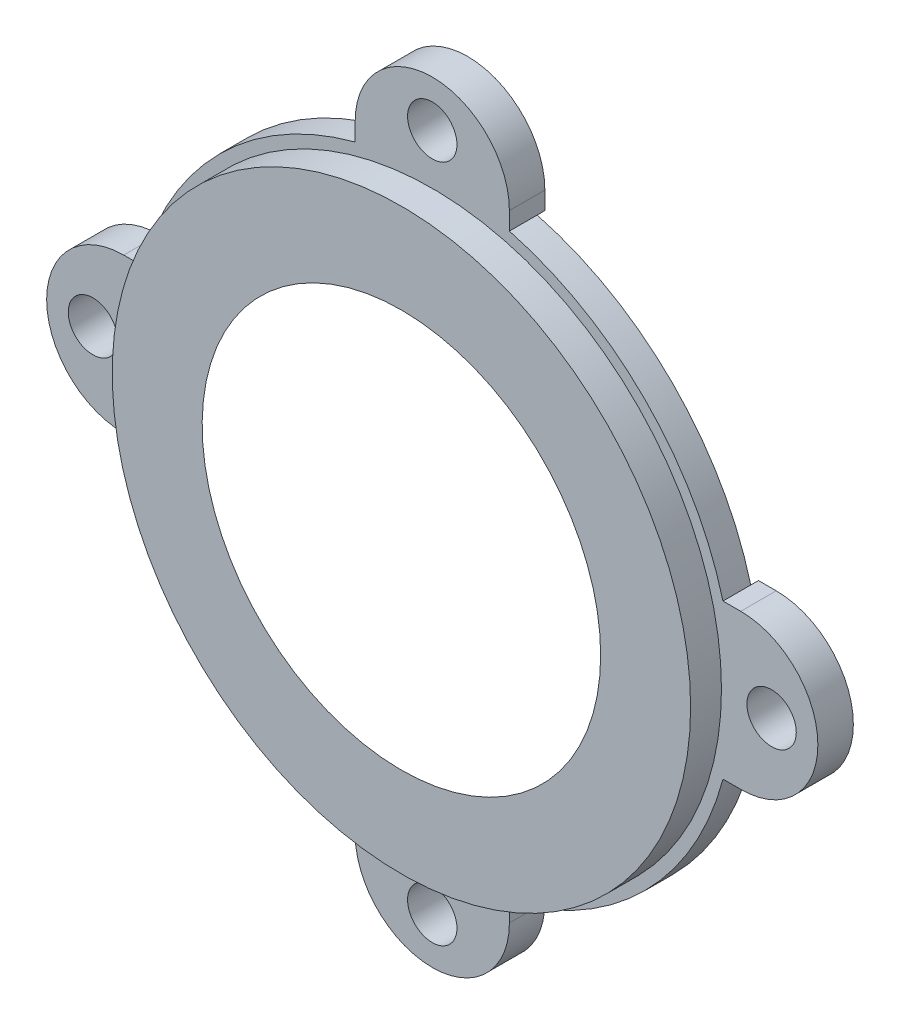
ISO-10303-21;
HEADER;
FILE_DESCRIPTION(('STEP AP214'),'2;1');
FILE_NAME('part.step','',(''),(''),'','','');
FILE_SCHEMA(('AUTOMOTIVE_DESIGN { 1 0 10303 214 1 1 1 1 }'));
ENDSEC;
DATA;
#1=APPLICATION_CONTEXT('core data for automotive mechanical design processes');
#2=APPLICATION_PROTOCOL_DEFINITION('international standard','automotive_design',2000,#1);
#3=PRODUCT_CONTEXT('',#1,'mechanical');
#4=PRODUCT('Part','Part','',(#3));
#5=PRODUCT_RELATED_PRODUCT_CATEGORY('part','',(#4));
#6=PRODUCT_DEFINITION_FORMATION('','',#4);
#7=PRODUCT_DEFINITION_CONTEXT('part definition',#1,'design');
#8=PRODUCT_DEFINITION('design','',#6,#7);
#9=PRODUCT_DEFINITION_SHAPE('','',#8);
#10=(LENGTH_UNIT() NAMED_UNIT(*) SI_UNIT(.MILLI.,.METRE.));
#11=(NAMED_UNIT(*) PLANE_ANGLE_UNIT() SI_UNIT($,.RADIAN.));
#12=(NAMED_UNIT(*) SI_UNIT($,.STERADIAN.) SOLID_ANGLE_UNIT());
#13=UNCERTAINTY_MEASURE_WITH_UNIT(LENGTH_MEASURE(1.E-05),#10,'distance_accuracy_value','');
#14=(GEOMETRIC_REPRESENTATION_CONTEXT(3) GLOBAL_UNCERTAINTY_ASSIGNED_CONTEXT((#13)) GLOBAL_UNIT_ASSIGNED_CONTEXT((#10,
#11,#12)) REPRESENTATION_CONTEXT('',''));
#15=CARTESIAN_POINT('',(0.,0.,0.));
#16=DIRECTION('',(0.,0.,1.));
#17=DIRECTION('',(1.,0.,0.));
#18=AXIS2_PLACEMENT_3D('',#15,#16,#17);
#19=CARTESIAN_POINT('',(0.,0.,1.8));
#20=DIRECTION('',(0.,0.,-1.));
#21=DIRECTION('',(-1.,0.,0.));
#22=AXIS2_PLACEMENT_3D('',#19,#20,#21);
#23=CYLINDRICAL_SURFACE('',#22,19.5);
#24=CARTESIAN_POINT('',(0.,0.,1.8));
#25=DIRECTION('',(0.,0.,1.));
#26=DIRECTION('',(1.,0.,0.));
#27=AXIS2_PLACEMENT_3D('',#24,#25,#26);
#28=CIRCLE('',#27,19.5);
#29=CARTESIAN_POINT('',(18.8480768249704,5.00000000000154,1.8));
#30=VERTEX_POINT('',#29);
#31=CARTESIAN_POINT('',(5.,18.8480768249708,1.8));
#32=VERTEX_POINT('',#31);
#33=EDGE_CURVE('E57',#30,#32,#28,.T.);
#34=ORIENTED_EDGE('',*,*,#33,.F.);
#35=DIRECTION('',(0.,0.,-1.));
#36=VECTOR('',#35,1.);
#37=CARTESIAN_POINT('',(18.8480768249704,5.00000000000154,13.5407903801862));
#38=LINE('',#37,#36);
#39=CARTESIAN_POINT('',(18.8480768249704,5.00000000000154,0.));
#40=VERTEX_POINT('',#39);
#41=EDGE_CURVE('E192',#30,#40,#38,.T.);
#42=ORIENTED_EDGE('',*,*,#41,.T.);
#43=CARTESIAN_POINT('',(0.,0.,0.));
#44=DIRECTION('',(0.,0.,1.));
#45=DIRECTION('',(1.,0.,0.));
#46=AXIS2_PLACEMENT_3D('',#43,#44,#45);
#47=CIRCLE('',#46,19.5);
#48=CARTESIAN_POINT('',(5.,18.8480768249708,0.));
#49=VERTEX_POINT('',#48);
#50=EDGE_CURVE('E311',#40,#49,#47,.T.);
#51=ORIENTED_EDGE('',*,*,#50,.T.);
#52=DIRECTION('',(0.,0.,-1.));
#53=VECTOR('',#52,1.);
#54=CARTESIAN_POINT('',(5.,18.8480768249708,1.8));
#55=LINE('',#54,#53);
#56=EDGE_CURVE('E353',#32,#49,#55,.T.);
#57=ORIENTED_EDGE('',*,*,#56,.F.);
#58=EDGE_LOOP('',(#34,#42,#51,#57));
#59=FACE_BOUND('',#58,.T.);
#60=ADVANCED_FACE('F41',(#59),#23,.T.);
#61=CARTESIAN_POINT('',(0.,0.,1.8));
#62=DIRECTION('',(0.,0.,1.));
#63=DIRECTION('',(1.,0.,0.));
#64=AXIS2_PLACEMENT_3D('',#61,#62,#63);
#65=PLANE('',#64);
#66=CARTESIAN_POINT('',(0.,0.,1.8));
#67=DIRECTION('',(0.,0.,1.));
#68=DIRECTION('',(1.,0.,0.));
#69=AXIS2_PLACEMENT_3D('',#66,#67,#68);
#70=CIRCLE('',#69,19.4999999999992);
#71=CARTESIAN_POINT('',(-18.8480768249704,-4.99999999999846,1.8));
#72=VERTEX_POINT('',#71);
#73=CARTESIAN_POINT('',(-5.,-18.8480768249699,1.8));
#74=VERTEX_POINT('',#73);
#75=EDGE_CURVE('E326',#72,#74,#70,.T.);
#76=ORIENTED_EDGE('',*,*,#75,.T.);
#77=DIRECTION('',(0.,-1.,0.));
#78=VECTOR('',#77,1.);
#79=CARTESIAN_POINT('',(-5.,-18.8480768249699,1.8));
#80=LINE('',#79,#78);
#81=CARTESIAN_POINT('',(-5.,-20.,1.8));
#82=VERTEX_POINT('',#81);
#83=EDGE_CURVE('E328',#74,#82,#80,.T.);
#84=ORIENTED_EDGE('',*,*,#83,.T.);
#85=CARTESIAN_POINT('',(0.,-20.,1.8));
#86=DIRECTION('',(0.,0.,1.));
#87=DIRECTION('',(1.,0.,0.));
#88=AXIS2_PLACEMENT_3D('',#85,#86,#87);
#89=CIRCLE('',#88,5.);
#90=CARTESIAN_POINT('',(5.,-20.,1.8));
#91=VERTEX_POINT('',#90);
#92=EDGE_CURVE('E362',#82,#91,#89,.T.);
#93=ORIENTED_EDGE('',*,*,#92,.T.);
#94=DIRECTION('',(0.,1.,0.));
#95=VECTOR('',#94,1.);
#96=CARTESIAN_POINT('',(5.,-25.,1.8));
#97=LINE('',#96,#95);
#98=CARTESIAN_POINT('',(5.,-18.8480768249708,1.8));
#99=VERTEX_POINT('',#98);
#100=EDGE_CURVE('E331',#91,#99,#97,.T.);
#101=ORIENTED_EDGE('',*,*,#100,.T.);
#102=CARTESIAN_POINT('',(18.8480768249711,-4.99999999999867,1.8));
#103=VERTEX_POINT('',#102);
#104=EDGE_CURVE('E312',#99,#103,#28,.T.);
#105=ORIENTED_EDGE('',*,*,#104,.T.);
#106=DIRECTION('',(-1.,-1.79206476713228E-13,0.));
#107=VECTOR('',#106,1.);
#108=CARTESIAN_POINT('',(18.8480768249711,-4.99999999999867,1.8));
#109=LINE('',#108,#107);
#110=CARTESIAN_POINT('',(20.,-4.99999999999846,1.8));
#111=VERTEX_POINT('',#110);
#112=EDGE_CURVE('E227',#111,#103,#109,.T.);
#113=ORIENTED_EDGE('',*,*,#112,.F.);
#114=CARTESIAN_POINT('',(20.,1.53783236145344E-12,1.8));
#115=DIRECTION('',(0.,0.,1.));
#116=DIRECTION('',(1.,0.,0.));
#117=AXIS2_PLACEMENT_3D('',#114,#115,#116);
#118=CIRCLE('',#117,5.);
#119=CARTESIAN_POINT('',(20.,5.00000000000154,1.8));
#120=VERTEX_POINT('',#119);
#121=EDGE_CURVE('E219',#120,#111,#118,.F.);
#122=ORIENTED_EDGE('',*,*,#121,.F.);
#123=DIRECTION('',(1.,0.,0.));
#124=VECTOR('',#123,1.);
#125=CARTESIAN_POINT('',(20.,5.00000000000154,1.8));
#126=LINE('',#125,#124);
#127=EDGE_CURVE('E189',#30,#120,#126,.T.);
#128=ORIENTED_EDGE('',*,*,#127,.F.);
#129=ORIENTED_EDGE('',*,*,#33,.T.);
#130=DIRECTION('',(0.,1.,0.));
#131=VECTOR('',#130,1.);
#132=CARTESIAN_POINT('',(5.,18.8480768249708,1.8));
#133=LINE('',#132,#131);
#134=CARTESIAN_POINT('',(5.,20.,1.8));
#135=VERTEX_POINT('',#134);
#136=EDGE_CURVE('E314',#32,#135,#133,.T.);
#137=ORIENTED_EDGE('',*,*,#136,.T.);
#138=CARTESIAN_POINT('',(0.,20.,1.8));
#139=DIRECTION('',(0.,0.,1.));
#140=DIRECTION('',(1.,0.,0.));
#141=AXIS2_PLACEMENT_3D('',#138,#139,#140);
#142=CIRCLE('',#141,5.);
#143=CARTESIAN_POINT('',(-5.,20.,1.8));
#144=VERTEX_POINT('',#143);
#145=EDGE_CURVE('E360',#135,#144,#142,.T.);
#146=ORIENTED_EDGE('',*,*,#145,.T.);
#147=DIRECTION('',(0.,-1.,0.));
#148=VECTOR('',#147,1.);
#149=CARTESIAN_POINT('',(-5.,25.,1.8));
#150=LINE('',#149,#148);
#151=CARTESIAN_POINT('',(-5.00000000000001,18.8480768249708,1.8));
#152=VERTEX_POINT('',#151);
#153=EDGE_CURVE('E317',#144,#152,#150,.T.);
#154=ORIENTED_EDGE('',*,*,#153,.T.);
#155=CARTESIAN_POINT('',(0.,0.,1.8));
#156=DIRECTION('',(0.,0.,1.));
#157=DIRECTION('',(1.,0.,0.));
#158=AXIS2_PLACEMENT_3D('',#155,#156,#157);
#159=CIRCLE('',#158,19.5);
#160=CARTESIAN_POINT('',(-18.8480768249704,5.00000000000154,1.8));
#161=VERTEX_POINT('',#160);
#162=EDGE_CURVE('E319',#152,#161,#159,.T.);
#163=ORIENTED_EDGE('',*,*,#162,.T.);
#164=DIRECTION('',(-1.,0.,0.));
#165=VECTOR('',#164,1.);
#166=CARTESIAN_POINT('',(-18.8480768249704,5.00000000000154,1.8));
#167=LINE('',#166,#165);
#168=CARTESIAN_POINT('',(-20.,5.00000000000154,1.8));
#169=VERTEX_POINT('',#168);
#170=EDGE_CURVE('E321',#161,#169,#167,.T.);
#171=ORIENTED_EDGE('',*,*,#170,.T.);
#172=CARTESIAN_POINT('',(-20.,1.53783236145344E-12,1.8));
#173=DIRECTION('',(0.,0.,1.));
#174=DIRECTION('',(1.,0.,0.));
#175=AXIS2_PLACEMENT_3D('',#172,#173,#174);
#176=CIRCLE('',#175,5.);
#177=CARTESIAN_POINT('',(-20.,-4.99999999999846,1.8));
#178=VERTEX_POINT('',#177);
#179=EDGE_CURVE('E358',#169,#178,#176,.T.);
#180=ORIENTED_EDGE('',*,*,#179,.T.);
#181=DIRECTION('',(1.,0.,0.));
#182=VECTOR('',#181,1.);
#183=CARTESIAN_POINT('',(-25.,-4.99999999999846,1.8));
#184=LINE('',#183,#182);
#185=EDGE_CURVE('E324',#178,#72,#184,.T.);
#186=ORIENTED_EDGE('',*,*,#185,.T.);
#187=EDGE_LOOP('',(#76,#84,#93,#101,#105,#113,#122,#128,#129,#137,#146,#154,#163,#171,#180,#186));
#188=FACE_BOUND('',#187,.T.);
#189=CARTESIAN_POINT('',(0.,0.,1.8));
#190=DIRECTION('',(0.,0.,1.));
#191=DIRECTION('',(1.,0.,0.));
#192=AXIS2_PLACEMENT_3D('',#189,#190,#191);
#193=CIRCLE('',#192,18.75);
#194=CARTESIAN_POINT('',(18.75,0.,1.8));
#195=VERTEX_POINT('',#194);
#196=EDGE_CURVE('E300',#195,#195,#193,.T.);
#197=ORIENTED_EDGE('',*,*,#196,.F.);
#198=EDGE_LOOP('',(#197));
#199=FACE_BOUND('',#198,.T.);
#200=CARTESIAN_POINT('',(0.,22.,1.8));
#201=DIRECTION('',(0.,0.,1.));
#202=DIRECTION('',(1.,0.,0.));
#203=AXIS2_PLACEMENT_3D('',#200,#201,#202);
#204=CIRCLE('',#203,1.6);
#205=CARTESIAN_POINT('',(1.6,22.,1.8));
#206=VERTEX_POINT('',#205);
#207=EDGE_CURVE('E308',#206,#206,#204,.T.);
#208=ORIENTED_EDGE('',*,*,#207,.F.);
#209=EDGE_LOOP('',(#208));
#210=FACE_BOUND('',#209,.T.);
#211=CARTESIAN_POINT('',(-22.,1.79413525164376E-12,1.8));
#212=DIRECTION('',(0.,0.,1.));
#213=DIRECTION('',(1.,0.,0.));
#214=AXIS2_PLACEMENT_3D('',#211,#212,#213);
#215=CIRCLE('',#214,1.6);
#216=CARTESIAN_POINT('',(-20.4,1.79413525164376E-12,1.8));
#217=VERTEX_POINT('',#216);
#218=EDGE_CURVE('E305',#217,#217,#215,.T.);
#219=ORIENTED_EDGE('',*,*,#218,.F.);
#220=EDGE_LOOP('',(#219));
#221=FACE_BOUND('',#220,.T.);
#222=CARTESIAN_POINT('',(-3.58827050328753E-12,-22.,1.8));
#223=DIRECTION('',(0.,0.,1.));
#224=DIRECTION('',(1.,0.,0.));
#225=AXIS2_PLACEMENT_3D('',#222,#223,#224);
#226=CIRCLE('',#225,1.6);
#227=CARTESIAN_POINT('',(1.59999999999641,-22.,1.8));
#228=VERTEX_POINT('',#227);
#229=EDGE_CURVE('E299',#228,#228,#226,.T.);
#230=ORIENTED_EDGE('',*,*,#229,.F.);
#231=EDGE_LOOP('',(#230));
#232=FACE_BOUND('',#231,.T.);
#233=CARTESIAN_POINT('',(22.,1.79413525164376E-12,1.8));
#234=DIRECTION('',(0.,0.,1.));
#235=DIRECTION('',(1.,0.,0.));
#236=AXIS2_PLACEMENT_3D('',#233,#234,#235);
#237=CIRCLE('',#236,1.6);
#238=CARTESIAN_POINT('',(23.6,1.79413525164376E-12,1.8));
#239=VERTEX_POINT('',#238);
#240=EDGE_CURVE('E223',#239,#239,#237,.F.);
#241=ORIENTED_EDGE('',*,*,#240,.T.);
#242=EDGE_LOOP('',(#241));
#243=FACE_BOUND('',#242,.T.);
#244=ADVANCED_FACE('F396',(#188,#199,#210,#221,#232,#243),#65,.T.);
#245=CARTESIAN_POINT('',(4.99999999999986,-18.8480768249702,0.));
#246=VERTEX_POINT('',#245);
#247=CARTESIAN_POINT('',(18.8480768249711,-4.99999999999867,0.));
#248=VERTEX_POINT('',#247);
#249=EDGE_CURVE('E334',#246,#248,#47,.T.);
#250=ORIENTED_EDGE('',*,*,#249,.T.);
#251=DIRECTION('',(0.,0.,-1.));
#252=VECTOR('',#251,1.);
#253=CARTESIAN_POINT('',(18.8480768249711,-4.99999999999867,13.5407903801862));
#254=LINE('',#253,#252);
#255=EDGE_CURVE('E65',#103,#248,#254,.T.);
#256=ORIENTED_EDGE('',*,*,#255,.F.);
#257=ORIENTED_EDGE('',*,*,#104,.F.);
#258=DIRECTION('',(0.,0.,-1.));
#259=VECTOR('',#258,1.);
#260=CARTESIAN_POINT('',(5.,-18.8480768249708,1.8));
#261=LINE('',#260,#259);
#262=EDGE_CURVE('E333',#99,#246,#261,.T.);
#263=ORIENTED_EDGE('',*,*,#262,.T.);
#264=EDGE_LOOP('',(#250,#256,#257,#263));
#265=FACE_BOUND('',#264,.T.);
#266=ADVANCED_FACE('F433',(#265),#23,.T.);
#267=CARTESIAN_POINT('',(5.,18.8480768249708,1.8));
#268=DIRECTION('',(-1.,0.,0.));
#269=DIRECTION('',(0.,-1.,0.));
#270=AXIS2_PLACEMENT_3D('',#267,#268,#269);
#271=PLANE('',#270);
#272=DIRECTION('',(0.,0.,-1.));
#273=VECTOR('',#272,1.);
#274=CARTESIAN_POINT('',(5.,20.,1.8));
#275=LINE('',#274,#273);
#276=CARTESIAN_POINT('',(5.,20.,-0.5));
#277=VERTEX_POINT('',#276);
#278=EDGE_CURVE('E366',#277,#135,#275,.F.);
#279=ORIENTED_EDGE('',*,*,#278,.T.);
#280=ORIENTED_EDGE('',*,*,#136,.F.);
#281=ORIENTED_EDGE('',*,*,#56,.T.);
#282=DIRECTION('',(0.,0.,1.));
#283=VECTOR('',#282,1.);
#284=CARTESIAN_POINT('',(5.,18.8480768249708,-0.5));
#285=LINE('',#284,#283);
#286=CARTESIAN_POINT('',(5.,18.8480768249708,-0.5));
#287=VERTEX_POINT('',#286);
#288=EDGE_CURVE('E288',#287,#49,#285,.T.);
#289=ORIENTED_EDGE('',*,*,#288,.F.);
#290=DIRECTION('',(0.,-1.,0.));
#291=VECTOR('',#290,1.);
#292=CARTESIAN_POINT('',(5.,20.,-0.5));
#293=LINE('',#292,#291);
#294=EDGE_CURVE('E278',#277,#287,#293,.T.);
#295=ORIENTED_EDGE('',*,*,#294,.F.);
#296=EDGE_LOOP('',(#279,#280,#281,#289,#295));
#297=FACE_BOUND('',#296,.T.);
#298=ADVANCED_FACE('F427',(#297),#271,.F.);
#299=CARTESIAN_POINT('',(-5.,25.,1.8));
#300=DIRECTION('',(1.,0.,0.));
#301=DIRECTION('',(0.,1.,0.));
#302=AXIS2_PLACEMENT_3D('',#299,#300,#301);
#303=PLANE('',#302);
#304=DIRECTION('',(0.,0.,1.));
#305=VECTOR('',#304,1.);
#306=CARTESIAN_POINT('',(-5.00000000000001,18.8480768249708,-0.5));
#307=LINE('',#306,#305);
#308=CARTESIAN_POINT('',(-5.00000000000001,18.8480768249708,-0.5));
#309=VERTEX_POINT('',#308);
#310=CARTESIAN_POINT('',(-5.00000000000001,18.8480768249708,0.));
#311=VERTEX_POINT('',#310);
#312=EDGE_CURVE('E285',#309,#311,#307,.T.);
#313=ORIENTED_EDGE('',*,*,#312,.T.);
#314=DIRECTION('',(0.,0.,-1.));
#315=VECTOR('',#314,1.);
#316=CARTESIAN_POINT('',(-5.00000000000001,18.8480768249708,1.8));
#317=LINE('',#316,#315);
#318=EDGE_CURVE('E351',#152,#311,#317,.T.);
#319=ORIENTED_EDGE('',*,*,#318,.F.);
#320=ORIENTED_EDGE('',*,*,#153,.F.);
#321=DIRECTION('',(0.,0.,-1.));
#322=VECTOR('',#321,1.);
#323=CARTESIAN_POINT('',(-5.,20.,1.8));
#324=LINE('',#323,#322);
#325=CARTESIAN_POINT('',(-5.,20.,-0.5));
#326=VERTEX_POINT('',#325);
#327=EDGE_CURVE('E368',#144,#326,#324,.T.);
#328=ORIENTED_EDGE('',*,*,#327,.T.);
#329=DIRECTION('',(0.,1.,0.));
#330=VECTOR('',#329,1.);
#331=CARTESIAN_POINT('',(-5.00000000000001,18.8480768249708,-0.5));
#332=LINE('',#331,#330);
#333=EDGE_CURVE('E282',#309,#326,#332,.T.);
#334=ORIENTED_EDGE('',*,*,#333,.F.);
#335=EDGE_LOOP('',(#313,#319,#320,#328,#334));
#336=FACE_BOUND('',#335,.T.);
#337=ADVANCED_FACE('F418',(#336),#303,.F.);
#338=CARTESIAN_POINT('',(0.,0.,1.8));
#339=DIRECTION('',(0.,0.,-1.));
#340=DIRECTION('',(-1.,0.,0.));
#341=AXIS2_PLACEMENT_3D('',#338,#339,#340);
#342=CYLINDRICAL_SURFACE('',#341,19.5);
#343=CARTESIAN_POINT('',(0.,0.,0.));
#344=DIRECTION('',(0.,0.,1.));
#345=DIRECTION('',(1.,0.,0.));
#346=AXIS2_PLACEMENT_3D('',#343,#344,#345);
#347=CIRCLE('',#346,19.5);
#348=CARTESIAN_POINT('',(-18.8480768249704,5.00000000000154,0.));
#349=VERTEX_POINT('',#348);
#350=EDGE_CURVE('E336',#311,#349,#347,.T.);
#351=ORIENTED_EDGE('',*,*,#350,.T.);
#352=DIRECTION('',(0.,0.,-1.));
#353=VECTOR('',#352,1.);
#354=CARTESIAN_POINT('',(-18.8480768249704,5.00000000000154,1.8));
#355=LINE('',#354,#353);
#356=EDGE_CURVE('E348',#161,#349,#355,.T.);
#357=ORIENTED_EDGE('',*,*,#356,.F.);
#358=ORIENTED_EDGE('',*,*,#162,.F.);
#359=ORIENTED_EDGE('',*,*,#318,.T.);
#360=EDGE_LOOP('',(#351,#357,#358,#359));
#361=FACE_BOUND('',#360,.T.);
#362=ADVANCED_FACE('F405',(#361),#342,.T.);
#363=CARTESIAN_POINT('',(-18.8480768249704,5.00000000000154,1.8));
#364=DIRECTION('',(0.,-1.,0.));
#365=DIRECTION('',(1.,0.,0.));
#366=AXIS2_PLACEMENT_3D('',#363,#364,#365);
#367=PLANE('',#366);
#368=DIRECTION('',(0.,0.,-1.));
#369=VECTOR('',#368,1.);
#370=CARTESIAN_POINT('',(-20.,5.00000000000154,1.8));
#371=LINE('',#370,#369);
#372=CARTESIAN_POINT('',(-20.,5.00000000000154,-0.5));
#373=VERTEX_POINT('',#372);
#374=EDGE_CURVE('E11',#373,#169,#371,.F.);
#375=ORIENTED_EDGE('',*,*,#374,.T.);
#376=ORIENTED_EDGE('',*,*,#170,.F.);
#377=ORIENTED_EDGE('',*,*,#356,.T.);
#378=DIRECTION('',(0.,0.,1.));
#379=VECTOR('',#378,1.);
#380=CARTESIAN_POINT('',(-18.8480768249704,5.00000000000154,-0.5));
#381=LINE('',#380,#379);
#382=CARTESIAN_POINT('',(-18.8480768249704,5.00000000000154,-0.5));
#383=VERTEX_POINT('',#382);
#384=EDGE_CURVE('E253',#383,#349,#381,.T.);
#385=ORIENTED_EDGE('',*,*,#384,.F.);
#386=DIRECTION('',(1.,0.,0.));
#387=VECTOR('',#386,1.);
#388=CARTESIAN_POINT('',(-20.,5.00000000000154,-0.5));
#389=LINE('',#388,#387);
#390=EDGE_CURVE('E264',#373,#383,#389,.T.);
#391=ORIENTED_EDGE('',*,*,#390,.F.);
#392=EDGE_LOOP('',(#375,#376,#377,#385,#391));
#393=FACE_BOUND('',#392,.T.);
#394=ADVANCED_FACE('F403',(#393),#367,.F.);
#395=CARTESIAN_POINT('',(-25.,-4.99999999999846,1.8));
#396=DIRECTION('',(0.,1.,0.));
#397=DIRECTION('',(0.,0.,1.));
#398=AXIS2_PLACEMENT_3D('',#395,#396,#397);
#399=PLANE('',#398);
#400=DIRECTION('',(0.,0.,1.));
#401=VECTOR('',#400,1.);
#402=CARTESIAN_POINT('',(-18.8480768249711,-4.99999999999867,-0.5));
#403=LINE('',#402,#401);
#404=CARTESIAN_POINT('',(-18.8480768249711,-4.99999999999867,-0.5));
#405=VERTEX_POINT('',#404);
#406=CARTESIAN_POINT('',(-18.8480768249711,-4.99999999999867,0.));
#407=VERTEX_POINT('',#406);
#408=EDGE_CURVE('E256',#405,#407,#403,.T.);
#409=ORIENTED_EDGE('',*,*,#408,.T.);
#410=DIRECTION('',(0.,0.,-1.));
#411=VECTOR('',#410,1.);
#412=CARTESIAN_POINT('',(-18.8480768249704,-4.99999999999846,1.8));
#413=LINE('',#412,#411);
#414=EDGE_CURVE('E346',#72,#407,#413,.T.);
#415=ORIENTED_EDGE('',*,*,#414,.F.);
#416=ORIENTED_EDGE('',*,*,#185,.F.);
#417=DIRECTION('',(0.,0.,-1.));
#418=VECTOR('',#417,1.);
#419=CARTESIAN_POINT('',(-20.,-4.99999999999846,1.8));
#420=LINE('',#419,#418);
#421=CARTESIAN_POINT('',(-20.,-4.99999999999846,-0.5));
#422=VERTEX_POINT('',#421);
#423=EDGE_CURVE('E50',#178,#422,#420,.T.);
#424=ORIENTED_EDGE('',*,*,#423,.T.);
#425=DIRECTION('',(-1.,1.79206476713228E-13,0.));
#426=VECTOR('',#425,1.);
#427=CARTESIAN_POINT('',(-18.8480768249711,-4.99999999999867,-0.5));
#428=LINE('',#427,#426);
#429=EDGE_CURVE('E259',#405,#422,#428,.T.);
#430=ORIENTED_EDGE('',*,*,#429,.F.);
#431=EDGE_LOOP('',(#409,#415,#416,#424,#430));
#432=FACE_BOUND('',#431,.T.);
#433=ADVANCED_FACE('F375',(#432),#399,.F.);
#434=CARTESIAN_POINT('',(0.,0.,1.8));
#435=DIRECTION('',(0.,0.,-1.));
#436=DIRECTION('',(-1.,0.,0.));
#437=AXIS2_PLACEMENT_3D('',#434,#435,#436);
#438=CYLINDRICAL_SURFACE('',#437,19.4999999999992);
#439=CARTESIAN_POINT('',(0.,0.,0.));
#440=DIRECTION('',(0.,0.,1.));
#441=DIRECTION('',(1.,0.,0.));
#442=AXIS2_PLACEMENT_3D('',#439,#440,#441);
#443=CIRCLE('',#442,19.4999999999992);
#444=CARTESIAN_POINT('',(-5.,-18.8480768249699,0.));
#445=VERTEX_POINT('',#444);
#446=EDGE_CURVE('E339',#407,#445,#443,.T.);
#447=ORIENTED_EDGE('',*,*,#446,.T.);
#448=DIRECTION('',(0.,0.,-1.));
#449=VECTOR('',#448,1.);
#450=CARTESIAN_POINT('',(-5.,-18.8480768249699,1.8));
#451=LINE('',#450,#449);
#452=EDGE_CURVE('E343',#74,#445,#451,.T.);
#453=ORIENTED_EDGE('',*,*,#452,.F.);
#454=ORIENTED_EDGE('',*,*,#75,.F.);
#455=ORIENTED_EDGE('',*,*,#414,.T.);
#456=EDGE_LOOP('',(#447,#453,#454,#455));
#457=FACE_BOUND('',#456,.T.);
#458=ADVANCED_FACE('F393',(#457),#438,.T.);
#459=CARTESIAN_POINT('',(-5.,-18.8480768249699,1.8));
#460=DIRECTION('',(1.,0.,0.));
#461=DIRECTION('',(0.,1.,0.));
#462=AXIS2_PLACEMENT_3D('',#459,#460,#461);
#463=PLANE('',#462);
#464=DIRECTION('',(0.,0.,-1.));
#465=VECTOR('',#464,1.);
#466=CARTESIAN_POINT('',(-5.,-20.,1.8));
#467=LINE('',#466,#465);
#468=CARTESIAN_POINT('',(-5.,-20.,-0.5));
#469=VERTEX_POINT('',#468);
#470=EDGE_CURVE('E364',#469,#82,#467,.F.);
#471=ORIENTED_EDGE('',*,*,#470,.T.);
#472=ORIENTED_EDGE('',*,*,#83,.F.);
#473=ORIENTED_EDGE('',*,*,#452,.T.);
#474=DIRECTION('',(0.,0.,1.));
#475=VECTOR('',#474,1.);
#476=CARTESIAN_POINT('',(-5.,-18.8480768249699,-0.5));
#477=LINE('',#476,#475);
#478=CARTESIAN_POINT('',(-5.,-18.8480768249699,-0.5));
#479=VERTEX_POINT('',#478);
#480=EDGE_CURVE('E226',#479,#445,#477,.T.);
#481=ORIENTED_EDGE('',*,*,#480,.F.);
#482=DIRECTION('',(0.,1.,0.));
#483=VECTOR('',#482,1.);
#484=CARTESIAN_POINT('',(-5.,-20.,-0.5));
#485=LINE('',#484,#483);
#486=EDGE_CURVE('E245',#469,#479,#485,.T.);
#487=ORIENTED_EDGE('',*,*,#486,.F.);
#488=EDGE_LOOP('',(#471,#472,#473,#481,#487));
#489=FACE_BOUND('',#488,.T.);
#490=ADVANCED_FACE('F476',(#489),#463,.F.);
#491=CARTESIAN_POINT('',(5.,-25.,1.8));
#492=DIRECTION('',(-1.,0.,0.));
#493=DIRECTION('',(0.,-1.,0.));
#494=AXIS2_PLACEMENT_3D('',#491,#492,#493);
#495=PLANE('',#494);
#496=DIRECTION('',(0.,0.,1.));
#497=VECTOR('',#496,1.);
#498=CARTESIAN_POINT('',(4.99999999999986,-18.8480768249702,-0.5));
#499=LINE('',#498,#497);
#500=CARTESIAN_POINT('',(4.99999999999986,-18.8480768249702,-0.5));
#501=VERTEX_POINT('',#500);
#502=EDGE_CURVE('E237',#501,#246,#499,.T.);
#503=ORIENTED_EDGE('',*,*,#502,.T.);
#504=ORIENTED_EDGE('',*,*,#262,.F.);
#505=ORIENTED_EDGE('',*,*,#100,.F.);
#506=DIRECTION('',(0.,0.,-1.));
#507=VECTOR('',#506,1.);
#508=CARTESIAN_POINT('',(5.,-20.,1.8));
#509=LINE('',#508,#507);
#510=CARTESIAN_POINT('',(5.,-20.,-0.5));
#511=VERTEX_POINT('',#510);
#512=EDGE_CURVE('E356',#91,#511,#509,.T.);
#513=ORIENTED_EDGE('',*,*,#512,.T.);
#514=DIRECTION('',(0.,-1.,0.));
#515=VECTOR('',#514,1.);
#516=CARTESIAN_POINT('',(4.99999999999991,-18.8480768249704,-0.5));
#517=LINE('',#516,#515);
#518=EDGE_CURVE('E240',#501,#511,#517,.T.);
#519=ORIENTED_EDGE('',*,*,#518,.F.);
#520=EDGE_LOOP('',(#503,#504,#505,#513,#519));
#521=FACE_BOUND('',#520,.T.);
#522=ADVANCED_FACE('F479',(#521),#495,.F.);
#523=CARTESIAN_POINT('',(0.,22.,1.8));
#524=DIRECTION('',(0.,0.,-1.));
#525=DIRECTION('',(-1.,0.,0.));
#526=AXIS2_PLACEMENT_3D('',#523,#524,#525);
#527=CYLINDRICAL_SURFACE('',#526,1.6);
#528=CARTESIAN_POINT('',(0.,22.,-0.5));
#529=DIRECTION('',(0.,0.,-1.));
#530=DIRECTION('',(-1.,0.,0.));
#531=AXIS2_PLACEMENT_3D('',#528,#529,#530);
#532=CIRCLE('',#531,1.6);
#533=CARTESIAN_POINT('',(-1.6,22.,-0.5));
#534=VERTEX_POINT('',#533);
#535=EDGE_CURVE('E272',#534,#534,#532,.T.);
#536=ORIENTED_EDGE('',*,*,#535,.T.);
#537=EDGE_LOOP('',(#536));
#538=FACE_BOUND('',#537,.T.);
#539=ORIENTED_EDGE('',*,*,#207,.T.);
#540=EDGE_LOOP('',(#539));
#541=FACE_BOUND('',#540,.T.);
#542=ADVANCED_FACE('F482',(#538,#541),#527,.F.);
#543=CARTESIAN_POINT('',(-22.,1.79413525164376E-12,1.8));
#544=DIRECTION('',(0.,0.,-1.));
#545=DIRECTION('',(-1.,0.,0.));
#546=AXIS2_PLACEMENT_3D('',#543,#544,#545);
#547=CYLINDRICAL_SURFACE('',#546,1.6);
#548=CARTESIAN_POINT('',(-22.,1.79413525164376E-12,-0.5));
#549=DIRECTION('',(0.,0.,-1.));
#550=DIRECTION('',(-1.,0.,0.));
#551=AXIS2_PLACEMENT_3D('',#548,#549,#550);
#552=CIRCLE('',#551,1.6);
#553=CARTESIAN_POINT('',(-23.6,1.79413525164376E-12,-0.5));
#554=VERTEX_POINT('',#553);
#555=EDGE_CURVE('E269',#554,#554,#552,.T.);
#556=ORIENTED_EDGE('',*,*,#555,.T.);
#557=EDGE_LOOP('',(#556));
#558=FACE_BOUND('',#557,.T.);
#559=ORIENTED_EDGE('',*,*,#218,.T.);
#560=EDGE_LOOP('',(#559));
#561=FACE_BOUND('',#560,.T.);
#562=ADVANCED_FACE('F487',(#558,#561),#547,.F.);
#563=CARTESIAN_POINT('',(-3.58827050328753E-12,-22.,1.8));
#564=DIRECTION('',(0.,0.,-1.));
#565=DIRECTION('',(-1.,0.,0.));
#566=AXIS2_PLACEMENT_3D('',#563,#564,#565);
#567=CYLINDRICAL_SURFACE('',#566,1.6);
#568=CARTESIAN_POINT('',(-3.58827050328753E-12,-22.,-0.5));
#569=DIRECTION('',(0.,0.,-1.));
#570=DIRECTION('',(-1.,0.,0.));
#571=AXIS2_PLACEMENT_3D('',#568,#569,#570);
#572=CIRCLE('',#571,1.6);
#573=CARTESIAN_POINT('',(-1.60000000000359,-22.,-0.5));
#574=VERTEX_POINT('',#573);
#575=EDGE_CURVE('E250',#574,#574,#572,.T.);
#576=ORIENTED_EDGE('',*,*,#575,.T.);
#577=EDGE_LOOP('',(#576));
#578=FACE_BOUND('',#577,.T.);
#579=ORIENTED_EDGE('',*,*,#229,.T.);
#580=EDGE_LOOP('',(#579));
#581=FACE_BOUND('',#580,.T.);
#582=ADVANCED_FACE('F491',(#578,#581),#567,.F.);
#583=CARTESIAN_POINT('',(0.,-20.,1.8));
#584=DIRECTION('',(0.,0.,-1.));
#585=DIRECTION('',(-1.,0.,0.));
#586=AXIS2_PLACEMENT_3D('',#583,#584,#585);
#587=CYLINDRICAL_SURFACE('',#586,5.);
#588=ORIENTED_EDGE('',*,*,#512,.F.);
#589=ORIENTED_EDGE('',*,*,#92,.F.);
#590=ORIENTED_EDGE('',*,*,#470,.F.);
#591=CARTESIAN_POINT('',(0.,-20.,-0.5));
#592=DIRECTION('',(0.,0.,-1.));
#593=DIRECTION('',(-1.,0.,0.));
#594=AXIS2_PLACEMENT_3D('',#591,#592,#593);
#595=CIRCLE('',#594,5.);
#596=EDGE_CURVE('E247',#511,#469,#595,.T.);
#597=ORIENTED_EDGE('',*,*,#596,.F.);
#598=EDGE_LOOP('',(#588,#589,#590,#597));
#599=FACE_BOUND('',#598,.T.);
#600=ADVANCED_FACE('F495',(#599),#587,.T.);
#601=CARTESIAN_POINT('',(0.,20.,1.8));
#602=DIRECTION('',(0.,0.,-1.));
#603=DIRECTION('',(-1.,0.,0.));
#604=AXIS2_PLACEMENT_3D('',#601,#602,#603);
#605=CYLINDRICAL_SURFACE('',#604,5.);
#606=ORIENTED_EDGE('',*,*,#145,.F.);
#607=ORIENTED_EDGE('',*,*,#278,.F.);
#608=CARTESIAN_POINT('',(0.,20.,-0.5));
#609=DIRECTION('',(0.,0.,-1.));
#610=DIRECTION('',(-1.,0.,0.));
#611=AXIS2_PLACEMENT_3D('',#608,#609,#610);
#612=CIRCLE('',#611,5.);
#613=EDGE_CURVE('E275',#326,#277,#612,.T.);
#614=ORIENTED_EDGE('',*,*,#613,.F.);
#615=ORIENTED_EDGE('',*,*,#327,.F.);
#616=EDGE_LOOP('',(#606,#607,#614,#615));
#617=FACE_BOUND('',#616,.T.);
#618=ADVANCED_FACE('F624',(#617),#605,.T.);
#619=CARTESIAN_POINT('',(-20.,1.53783236145344E-12,1.8));
#620=DIRECTION('',(0.,0.,-1.));
#621=DIRECTION('',(-1.,0.,0.));
#622=AXIS2_PLACEMENT_3D('',#619,#620,#621);
#623=CYLINDRICAL_SURFACE('',#622,5.);
#624=CARTESIAN_POINT('',(-20.,1.53783236145344E-12,-0.5));
#625=DIRECTION('',(0.,0.,-1.));
#626=DIRECTION('',(-1.,0.,0.));
#627=AXIS2_PLACEMENT_3D('',#624,#625,#626);
#628=CIRCLE('',#627,5.);
#629=EDGE_CURVE('E266',#422,#373,#628,.T.);
#630=ORIENTED_EDGE('',*,*,#629,.F.);
#631=ORIENTED_EDGE('',*,*,#423,.F.);
#632=ORIENTED_EDGE('',*,*,#179,.F.);
#633=ORIENTED_EDGE('',*,*,#374,.F.);
#634=EDGE_LOOP('',(#630,#631,#632,#633));
#635=FACE_BOUND('',#634,.T.);
#636=ADVANCED_FACE('F43',(#635),#623,.T.);
#637=CARTESIAN_POINT('',(0.,0.,3.8));
#638=DIRECTION('',(0.,0.,1.));
#639=DIRECTION('',(1.,0.,0.));
#640=AXIS2_PLACEMENT_3D('',#637,#638,#639);
#641=PLANE('',#640);
#642=CARTESIAN_POINT('',(0.,0.,3.8));
#643=DIRECTION('',(0.,0.,1.));
#644=DIRECTION('',(1.,0.,0.));
#645=AXIS2_PLACEMENT_3D('',#642,#643,#644);
#646=CIRCLE('',#645,12.9182069312383);
#647=CARTESIAN_POINT('',(12.9182069312383,0.,3.8));
#648=VERTEX_POINT('',#647);
#649=EDGE_CURVE('E45',#648,#648,#646,.T.);
#650=ORIENTED_EDGE('',*,*,#649,.F.);
#651=EDGE_LOOP('',(#650));
#652=FACE_BOUND('',#651,.T.);
#653=CARTESIAN_POINT('',(0.,0.,3.8));
#654=DIRECTION('',(0.,0.,1.));
#655=DIRECTION('',(1.,0.,0.));
#656=AXIS2_PLACEMENT_3D('',#653,#654,#655);
#657=CIRCLE('',#656,18.75);
#658=CARTESIAN_POINT('',(18.75,0.,3.8));
#659=VERTEX_POINT('',#658);
#660=EDGE_CURVE('E296',#659,#659,#657,.T.);
#661=ORIENTED_EDGE('',*,*,#660,.T.);
#662=EDGE_LOOP('',(#661));
#663=FACE_BOUND('',#662,.T.);
#664=ADVANCED_FACE('F500',(#652,#663),#641,.T.);
#665=CARTESIAN_POINT('',(0.,0.,3.8));
#666=DIRECTION('',(0.,0.,-1.));
#667=DIRECTION('',(-1.,0.,0.));
#668=AXIS2_PLACEMENT_3D('',#665,#666,#667);
#669=CYLINDRICAL_SURFACE('',#668,18.75);
#670=ORIENTED_EDGE('',*,*,#660,.F.);
#671=EDGE_LOOP('',(#670));
#672=FACE_BOUND('',#671,.T.);
#673=ORIENTED_EDGE('',*,*,#196,.T.);
#674=EDGE_LOOP('',(#673));
#675=FACE_BOUND('',#674,.T.);
#676=ADVANCED_FACE('F497',(#672,#675),#669,.T.);
#677=CARTESIAN_POINT('',(0.,0.,4.04145188432739));
#678=DIRECTION('',(0.,0.,-1.));
#679=DIRECTION('',(-1.,0.,0.));
#680=AXIS2_PLACEMENT_3D('',#677,#678,#679);
#681=CONICAL_SURFACE('',#680,12.5,1.0471975511966);
#682=ORIENTED_EDGE('',*,*,#649,.T.);
#683=EDGE_LOOP('',(#682));
#684=FACE_BOUND('',#683,.T.);
#685=CARTESIAN_POINT('',(0.,0.,0.));
#686=DIRECTION('',(0.,0.,1.));
#687=DIRECTION('',(1.,0.,0.));
#688=AXIS2_PLACEMENT_3D('',#685,#686,#687);
#689=CIRCLE('',#688,19.5);
#690=EDGE_CURVE('E292',#49,#311,#689,.T.);
#691=ORIENTED_EDGE('',*,*,#690,.F.);
#692=ORIENTED_EDGE('',*,*,#50,.F.);
#693=CARTESIAN_POINT('',(0.,0.,0.));
#694=DIRECTION('',(0.,0.,1.));
#695=DIRECTION('',(1.,0.,0.));
#696=AXIS2_PLACEMENT_3D('',#693,#694,#695);
#697=CIRCLE('',#696,19.5);
#698=EDGE_CURVE('E220',#248,#40,#697,.T.);
#699=ORIENTED_EDGE('',*,*,#698,.F.);
#700=ORIENTED_EDGE('',*,*,#249,.F.);
#701=EDGE_CURVE('E291',#445,#246,#689,.T.);
#702=ORIENTED_EDGE('',*,*,#701,.F.);
#703=ORIENTED_EDGE('',*,*,#446,.F.);
#704=EDGE_CURVE('E295',#349,#407,#689,.T.);
#705=ORIENTED_EDGE('',*,*,#704,.F.);
#706=ORIENTED_EDGE('',*,*,#350,.F.);
#707=EDGE_LOOP('',(#691,#692,#699,#700,#702,#703,#705,#706));
#708=FACE_BOUND('',#707,.T.);
#709=ADVANCED_FACE('F410',(#684,#708),#681,.F.);
#710=CARTESIAN_POINT('',(0.,20.,-0.5));
#711=DIRECTION('',(0.,0.,-1.));
#712=DIRECTION('',(-1.,0.,0.));
#713=AXIS2_PLACEMENT_3D('',#710,#711,#712);
#714=PLANE('',#713);
#715=ORIENTED_EDGE('',*,*,#613,.T.);
#716=ORIENTED_EDGE('',*,*,#294,.T.);
#717=CARTESIAN_POINT('',(0.,0.,-0.5));
#718=DIRECTION('',(0.,0.,1.));
#719=DIRECTION('',(-1.,0.,0.));
#720=AXIS2_PLACEMENT_3D('',#717,#718,#719);
#721=CIRCLE('',#720,19.5);
#722=EDGE_CURVE('E280',#287,#309,#721,.T.);
#723=ORIENTED_EDGE('',*,*,#722,.T.);
#724=ORIENTED_EDGE('',*,*,#333,.T.);
#725=EDGE_LOOP('',(#715,#716,#723,#724));
#726=FACE_BOUND('',#725,.T.);
#727=ORIENTED_EDGE('',*,*,#535,.F.);
#728=EDGE_LOOP('',(#727));
#729=FACE_BOUND('',#728,.T.);
#730=ADVANCED_FACE('F423',(#726,#729),#714,.T.);
#731=CARTESIAN_POINT('',(0.,0.,-0.5));
#732=DIRECTION('',(0.,0.,1.));
#733=DIRECTION('',(1.,0.,0.));
#734=AXIS2_PLACEMENT_3D('',#731,#732,#733);
#735=CYLINDRICAL_SURFACE('',#734,19.5);
#736=ORIENTED_EDGE('',*,*,#690,.T.);
#737=ORIENTED_EDGE('',*,*,#312,.F.);
#738=ORIENTED_EDGE('',*,*,#722,.F.);
#739=ORIENTED_EDGE('',*,*,#288,.T.);
#740=EDGE_LOOP('',(#736,#737,#738,#739));
#741=FACE_BOUND('',#740,.T.);
#742=ADVANCED_FACE('F413',(#741),#735,.F.);
#743=CARTESIAN_POINT('',(-20.,1.53783236145344E-12,-0.5));
#744=DIRECTION('',(0.,0.,-1.));
#745=DIRECTION('',(-1.,0.,0.));
#746=AXIS2_PLACEMENT_3D('',#743,#744,#745);
#747=PLANE('',#746);
#748=ORIENTED_EDGE('',*,*,#629,.T.);
#749=ORIENTED_EDGE('',*,*,#390,.T.);
#750=CARTESIAN_POINT('',(0.,0.,-0.5));
#751=DIRECTION('',(0.,0.,1.));
#752=DIRECTION('',(-1.,0.,0.));
#753=AXIS2_PLACEMENT_3D('',#750,#751,#752);
#754=CIRCLE('',#753,19.5);
#755=EDGE_CURVE('E262',#383,#405,#754,.T.);
#756=ORIENTED_EDGE('',*,*,#755,.T.);
#757=ORIENTED_EDGE('',*,*,#429,.T.);
#758=EDGE_LOOP('',(#748,#749,#756,#757));
#759=FACE_BOUND('',#758,.T.);
#760=ORIENTED_EDGE('',*,*,#555,.F.);
#761=EDGE_LOOP('',(#760));
#762=FACE_BOUND('',#761,.T.);
#763=ADVANCED_FACE('F381',(#759,#762),#747,.T.);
#764=CARTESIAN_POINT('',(0.,0.,-0.5));
#765=DIRECTION('',(0.,0.,1.));
#766=DIRECTION('',(1.,0.,0.));
#767=AXIS2_PLACEMENT_3D('',#764,#765,#766);
#768=CYLINDRICAL_SURFACE('',#767,19.5);
#769=ORIENTED_EDGE('',*,*,#704,.T.);
#770=ORIENTED_EDGE('',*,*,#408,.F.);
#771=ORIENTED_EDGE('',*,*,#755,.F.);
#772=ORIENTED_EDGE('',*,*,#384,.T.);
#773=EDGE_LOOP('',(#769,#770,#771,#772));
#774=FACE_BOUND('',#773,.T.);
#775=ADVANCED_FACE('F388',(#774),#768,.F.);
#776=CARTESIAN_POINT('',(0.,-20.,-0.5));
#777=DIRECTION('',(0.,0.,-1.));
#778=DIRECTION('',(-1.,0.,0.));
#779=AXIS2_PLACEMENT_3D('',#776,#777,#778);
#780=PLANE('',#779);
#781=ORIENTED_EDGE('',*,*,#596,.T.);
#782=ORIENTED_EDGE('',*,*,#486,.T.);
#783=CARTESIAN_POINT('',(0.,0.,-0.5));
#784=DIRECTION('',(0.,0.,1.));
#785=DIRECTION('',(-1.,0.,0.));
#786=AXIS2_PLACEMENT_3D('',#783,#784,#785);
#787=CIRCLE('',#786,19.4999999999994);
#788=EDGE_CURVE('E243',#479,#501,#787,.T.);
#789=ORIENTED_EDGE('',*,*,#788,.T.);
#790=ORIENTED_EDGE('',*,*,#518,.T.);
#791=EDGE_LOOP('',(#781,#782,#789,#790));
#792=FACE_BOUND('',#791,.T.);
#793=ORIENTED_EDGE('',*,*,#575,.F.);
#794=EDGE_LOOP('',(#793));
#795=FACE_BOUND('',#794,.T.);
#796=ADVANCED_FACE('F516',(#792,#795),#780,.T.);
#797=CARTESIAN_POINT('',(0.,0.,-0.5));
#798=DIRECTION('',(0.,0.,1.));
#799=DIRECTION('',(1.,0.,0.));
#800=AXIS2_PLACEMENT_3D('',#797,#798,#799);
#801=CYLINDRICAL_SURFACE('',#800,19.4999999999994);
#802=ORIENTED_EDGE('',*,*,#701,.T.);
#803=ORIENTED_EDGE('',*,*,#502,.F.);
#804=ORIENTED_EDGE('',*,*,#788,.F.);
#805=ORIENTED_EDGE('',*,*,#480,.T.);
#806=EDGE_LOOP('',(#802,#803,#804,#805));
#807=FACE_BOUND('',#806,.T.);
#808=ADVANCED_FACE('F519',(#807),#801,.F.);
#809=CARTESIAN_POINT('',(20.,1.53783236145344E-12,13.5407903801862));
#810=DIRECTION('',(0.,0.,-1.));
#811=DIRECTION('',(-1.,0.,0.));
#812=AXIS2_PLACEMENT_3D('',#809,#810,#811);
#813=CYLINDRICAL_SURFACE('',#812,5.);
#814=DIRECTION('',(0.,0.,-1.));
#815=VECTOR('',#814,1.);
#816=CARTESIAN_POINT('',(20.,5.00000000000154,13.5407903801862));
#817=LINE('',#816,#815);
#818=CARTESIAN_POINT('',(20.,5.00000000000154,-0.5));
#819=VERTEX_POINT('',#818);
#820=EDGE_CURVE('E182',#120,#819,#817,.T.);
#821=ORIENTED_EDGE('',*,*,#820,.F.);
#822=ORIENTED_EDGE('',*,*,#121,.T.);
#823=DIRECTION('',(0.,0.,-1.));
#824=VECTOR('',#823,1.);
#825=CARTESIAN_POINT('',(20.,-4.99999999999846,13.5407903801862));
#826=LINE('',#825,#824);
#827=CARTESIAN_POINT('',(20.,-4.99999999999846,-0.5));
#828=VERTEX_POINT('',#827);
#829=EDGE_CURVE('E198',#111,#828,#826,.T.);
#830=ORIENTED_EDGE('',*,*,#829,.T.);
#831=CARTESIAN_POINT('',(20.,1.53783236145344E-12,-0.5));
#832=DIRECTION('',(0.,0.,-1.));
#833=DIRECTION('',(1.,0.,0.));
#834=AXIS2_PLACEMENT_3D('',#831,#832,#833);
#835=CIRCLE('',#834,5.);
#836=EDGE_CURVE('E195',#819,#828,#835,.T.);
#837=ORIENTED_EDGE('',*,*,#836,.F.);
#838=EDGE_LOOP('',(#821,#822,#830,#837));
#839=FACE_BOUND('',#838,.T.);
#840=ADVANCED_FACE('F196',(#839),#813,.T.);
#841=CARTESIAN_POINT('',(20.,5.00000000000154,13.5407903801862));
#842=DIRECTION('',(0.,1.,0.));
#843=DIRECTION('',(0.,0.,1.));
#844=AXIS2_PLACEMENT_3D('',#841,#842,#843);
#845=PLANE('',#844);
#846=ORIENTED_EDGE('',*,*,#41,.F.);
#847=ORIENTED_EDGE('',*,*,#127,.T.);
#848=ORIENTED_EDGE('',*,*,#820,.T.);
#849=DIRECTION('',(1.,0.,0.));
#850=VECTOR('',#849,1.);
#851=CARTESIAN_POINT('',(20.,5.00000000000154,-0.5));
#852=LINE('',#851,#850);
#853=CARTESIAN_POINT('',(18.8480768249704,5.00000000000154,-0.5));
#854=VERTEX_POINT('',#853);
#855=EDGE_CURVE('E188',#854,#819,#852,.T.);
#856=ORIENTED_EDGE('',*,*,#855,.F.);
#857=DIRECTION('',(0.,0.,1.));
#858=VECTOR('',#857,1.);
#859=CARTESIAN_POINT('',(18.8480768249704,5.00000000000154,-0.5));
#860=LINE('',#859,#858);
#861=EDGE_CURVE('E209',#854,#40,#860,.T.);
#862=ORIENTED_EDGE('',*,*,#861,.T.);
#863=EDGE_LOOP('',(#846,#847,#848,#856,#862));
#864=FACE_BOUND('',#863,.T.);
#865=ADVANCED_FACE('F185',(#864),#845,.T.);
#866=CARTESIAN_POINT('',(18.8480768249711,-4.99999999999867,13.5407903801862));
#867=DIRECTION('',(1.79206476713228E-13,-1.,0.));
#868=DIRECTION('',(1.,1.79206476713228E-13,0.));
#869=AXIS2_PLACEMENT_3D('',#866,#867,#868);
#870=PLANE('',#869);
#871=ORIENTED_EDGE('',*,*,#829,.F.);
#872=ORIENTED_EDGE('',*,*,#112,.T.);
#873=ORIENTED_EDGE('',*,*,#255,.T.);
#874=DIRECTION('',(0.,0.,1.));
#875=VECTOR('',#874,1.);
#876=CARTESIAN_POINT('',(18.8480768249711,-4.99999999999867,-0.5));
#877=LINE('',#876,#875);
#878=CARTESIAN_POINT('',(18.8480768249711,-4.99999999999867,-0.5));
#879=VERTEX_POINT('',#878);
#880=EDGE_CURVE('E212',#879,#248,#877,.T.);
#881=ORIENTED_EDGE('',*,*,#880,.F.);
#882=DIRECTION('',(-1.,-1.79206476713228E-13,0.));
#883=VECTOR('',#882,1.);
#884=CARTESIAN_POINT('',(18.8480768249711,-4.99999999999867,-0.5));
#885=LINE('',#884,#883);
#886=EDGE_CURVE('E202',#828,#879,#885,.T.);
#887=ORIENTED_EDGE('',*,*,#886,.F.);
#888=EDGE_LOOP('',(#871,#872,#873,#881,#887));
#889=FACE_BOUND('',#888,.T.);
#890=ADVANCED_FACE('F437',(#889),#870,.T.);
#891=CARTESIAN_POINT('',(22.,1.79413525164376E-12,13.5407903801862));
#892=DIRECTION('',(0.,0.,-1.));
#893=DIRECTION('',(-1.,0.,0.));
#894=AXIS2_PLACEMENT_3D('',#891,#892,#893);
#895=CYLINDRICAL_SURFACE('',#894,1.6);
#896=ORIENTED_EDGE('',*,*,#240,.F.);
#897=EDGE_LOOP('',(#896));
#898=FACE_BOUND('',#897,.T.);
#899=CARTESIAN_POINT('',(22.,1.79413525164376E-12,-0.5));
#900=DIRECTION('',(0.,0.,-1.));
#901=DIRECTION('',(1.,0.,0.));
#902=AXIS2_PLACEMENT_3D('',#899,#900,#901);
#903=CIRCLE('',#902,1.6);
#904=CARTESIAN_POINT('',(23.6,1.79413525164376E-12,-0.5));
#905=VERTEX_POINT('',#904);
#906=EDGE_CURVE('E201',#905,#905,#903,.T.);
#907=ORIENTED_EDGE('',*,*,#906,.T.);
#908=EDGE_LOOP('',(#907));
#909=FACE_BOUND('',#908,.T.);
#910=ADVANCED_FACE('F445',(#898,#909),#895,.F.);
#911=CARTESIAN_POINT('',(20.,1.53783236145344E-12,-0.5));
#912=DIRECTION('',(0.,0.,1.));
#913=DIRECTION('',(1.,0.,0.));
#914=AXIS2_PLACEMENT_3D('',#911,#912,#913);
#915=PLANE('',#914);
#916=ORIENTED_EDGE('',*,*,#836,.T.);
#917=ORIENTED_EDGE('',*,*,#886,.T.);
#918=CARTESIAN_POINT('',(0.,0.,-0.5));
#919=DIRECTION('',(0.,0.,1.));
#920=DIRECTION('',(1.,0.,0.));
#921=AXIS2_PLACEMENT_3D('',#918,#919,#920);
#922=CIRCLE('',#921,19.5);
#923=EDGE_CURVE('E207',#879,#854,#922,.T.);
#924=ORIENTED_EDGE('',*,*,#923,.T.);
#925=ORIENTED_EDGE('',*,*,#855,.T.);
#926=EDGE_LOOP('',(#916,#917,#924,#925));
#927=FACE_BOUND('',#926,.T.);
#928=ORIENTED_EDGE('',*,*,#906,.F.);
#929=EDGE_LOOP('',(#928));
#930=FACE_BOUND('',#929,.T.);
#931=ADVANCED_FACE('F204',(#927,#930),#915,.F.);
#932=CARTESIAN_POINT('',(0.,0.,-0.5));
#933=DIRECTION('',(0.,0.,1.));
#934=DIRECTION('',(1.,0.,0.));
#935=AXIS2_PLACEMENT_3D('',#932,#933,#934);
#936=CYLINDRICAL_SURFACE('',#935,19.5);
#937=ORIENTED_EDGE('',*,*,#698,.T.);
#938=ORIENTED_EDGE('',*,*,#861,.F.);
#939=ORIENTED_EDGE('',*,*,#923,.F.);
#940=ORIENTED_EDGE('',*,*,#880,.T.);
#941=EDGE_LOOP('',(#937,#938,#939,#940));
#942=FACE_BOUND('',#941,.T.);
#943=ADVANCED_FACE('F438',(#942),#936,.F.);
#944=CLOSED_SHELL('',(#60,#244,#266,#298,#337,#362,#394,#433,#458,#490,#522,#542,#562,#582,#600,
#618,#636,#664,#676,#709,#730,#742,#763,#775,#796,#808,#840,#865,#890,#910,#931,#943));
#945=MANIFOLD_SOLID_BREP('B2',#944);
#946=ADVANCED_BREP_SHAPE_REPRESENTATION('',(#18,#945),#14);
#947=SHAPE_DEFINITION_REPRESENTATION(#9,#946);
ENDSEC;
END-ISO-10303-21;
